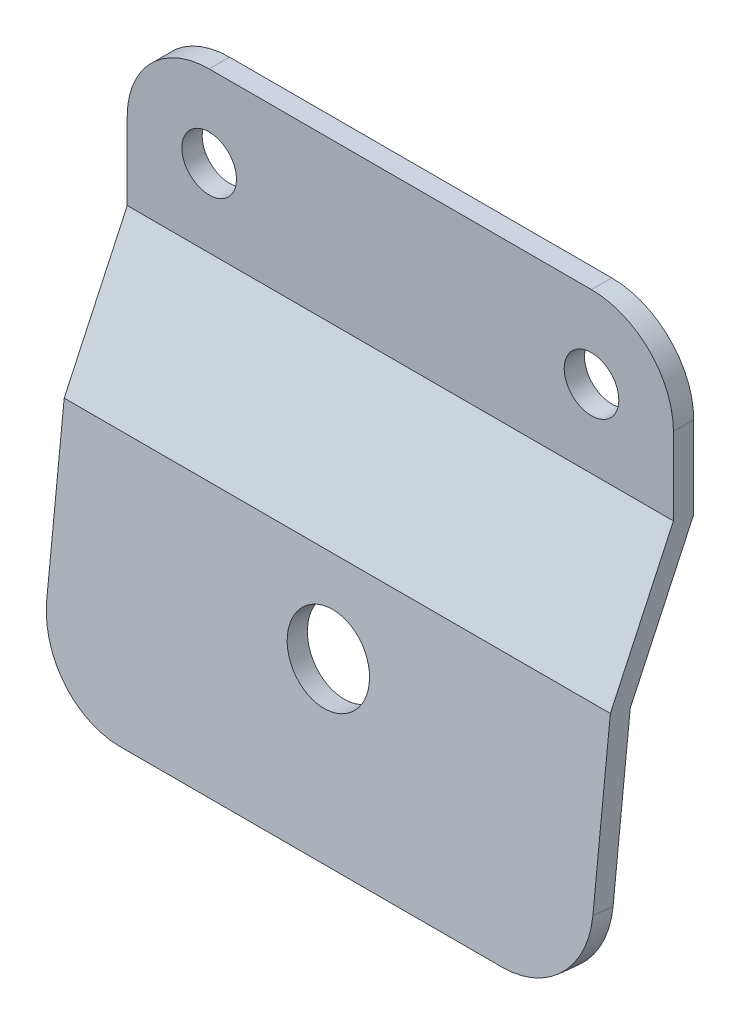
ISO-10303-21;
HEADER;
FILE_DESCRIPTION(('STEP AP214'),'2;1');
FILE_NAME('part.step','',(''),(''),'','','');
FILE_SCHEMA(('AUTOMOTIVE_DESIGN { 1 0 10303 214 1 1 1 1 }'));
ENDSEC;
DATA;
#1=APPLICATION_CONTEXT('core data for automotive mechanical design processes');
#2=APPLICATION_PROTOCOL_DEFINITION('international standard','automotive_design',2000,#1);
#3=PRODUCT_CONTEXT('',#1,'mechanical');
#4=PRODUCT('Part','Part','',(#3));
#5=PRODUCT_RELATED_PRODUCT_CATEGORY('part','',(#4));
#6=PRODUCT_DEFINITION_FORMATION('','',#4);
#7=PRODUCT_DEFINITION_CONTEXT('part definition',#1,'design');
#8=PRODUCT_DEFINITION('design','',#6,#7);
#9=PRODUCT_DEFINITION_SHAPE('','',#8);
#10=(LENGTH_UNIT() NAMED_UNIT(*) SI_UNIT(.MILLI.,.METRE.));
#11=(NAMED_UNIT(*) PLANE_ANGLE_UNIT() SI_UNIT($,.RADIAN.));
#12=(NAMED_UNIT(*) SI_UNIT($,.STERADIAN.) SOLID_ANGLE_UNIT());
#13=UNCERTAINTY_MEASURE_WITH_UNIT(LENGTH_MEASURE(1.E-05),#10,'distance_accuracy_value','');
#14=(GEOMETRIC_REPRESENTATION_CONTEXT(3) GLOBAL_UNCERTAINTY_ASSIGNED_CONTEXT((#13)) GLOBAL_UNIT_ASSIGNED_CONTEXT((#10,
#11,#12)) REPRESENTATION_CONTEXT('',''));
#15=CARTESIAN_POINT('',(0.,0.,0.));
#16=DIRECTION('',(0.,0.,1.));
#17=DIRECTION('',(1.,0.,0.));
#18=AXIS2_PLACEMENT_3D('',#15,#16,#17);
#19=CARTESIAN_POINT('',(31.75,-15.590992704092,9.73459826881002));
#20=DIRECTION('',(0.,-0.104528463267654,-0.994521895368273));
#21=DIRECTION('',(0.,0.994521895368273,-0.104528463267654));
#22=AXIS2_PLACEMENT_3D('',#19,#20,#21);
#23=PLANE('',#22);
#24=CARTESIAN_POINT('',(0.,-25.0638137574748,10.7302318814344));
#25=DIRECTION('',(0.,-0.104528463267654,-0.994521895368273));
#26=DIRECTION('',(0.,0.994521895368273,-0.104528463267654));
#27=AXIS2_PLACEMENT_3D('',#24,#25,#26);
#28=CIRCLE('',#27,4.7625);
#29=CARTESIAN_POINT('',(0.,-20.3274032307834,10.2324150751222));
#30=VERTEX_POINT('',#29);
#31=EDGE_CURVE('E190',#30,#30,#28,.T.);
#32=ORIENTED_EDGE('',*,*,#31,.T.);
#33=EDGE_LOOP('',(#32));
#34=FACE_BOUND('',#33,.T.);
#35=DIRECTION('',(0.,-0.994521895368273,0.104528463267654));
#36=VECTOR('',#35,1.);
#37=CARTESIAN_POINT('',(-31.75,-15.590992704092,9.73459826881002));
#38=LINE('',#37,#36);
#39=CARTESIAN_POINT('',(-31.75,-15.1978614696643,9.69327851105644));
#40=VERTEX_POINT('',#39);
#41=CARTESIAN_POINT('',(-31.75,-34.5366348108576,11.7258654940588));
#42=VERTEX_POINT('',#41);
#43=EDGE_CURVE('E144',#40,#42,#38,.T.);
#44=ORIENTED_EDGE('',*,*,#43,.T.);
#45=CARTESIAN_POINT('',(-22.225,-34.5366348108576,11.7258654940588));
#46=DIRECTION('',(0.,-0.104528463267654,-0.994521895368273));
#47=DIRECTION('',(0.,0.994521895368273,-0.104528463267654));
#48=AXIS2_PLACEMENT_3D('',#45,#46,#47);
#49=CIRCLE('',#48,9.525);
#50=CARTESIAN_POINT('',(-22.225,-44.0094558642404,12.7214991066832));
#51=VERTEX_POINT('',#50);
#52=EDGE_CURVE('E204',#42,#51,#49,.F.);
#53=ORIENTED_EDGE('',*,*,#52,.T.);
#54=DIRECTION('',(-1.,0.,0.));
#55=VECTOR('',#54,1.);
#56=CARTESIAN_POINT('',(31.75,-44.0094558642404,12.7214991066832));
#57=LINE('',#56,#55);
#58=CARTESIAN_POINT('',(22.225,-44.0094558642404,12.7214991066832));
#59=VERTEX_POINT('',#58);
#60=EDGE_CURVE('E183',#59,#51,#57,.T.);
#61=ORIENTED_EDGE('',*,*,#60,.F.);
#62=CARTESIAN_POINT('',(22.225,-34.5366348108576,11.7258654940588));
#63=DIRECTION('',(0.,-0.104528463267654,-0.994521895368273));
#64=DIRECTION('',(0.,0.994521895368273,-0.104528463267654));
#65=AXIS2_PLACEMENT_3D('',#62,#63,#64);
#66=CIRCLE('',#65,9.525);
#67=CARTESIAN_POINT('',(31.75,-34.5366348108576,11.7258654940588));
#68=VERTEX_POINT('',#67);
#69=EDGE_CURVE('E202',#59,#68,#66,.F.);
#70=ORIENTED_EDGE('',*,*,#69,.T.);
#71=DIRECTION('',(0.,-0.994521895368273,0.104528463267654));
#72=VECTOR('',#71,1.);
#73=CARTESIAN_POINT('',(31.75,-15.590992704092,9.73459826881002));
#74=LINE('',#73,#72);
#75=CARTESIAN_POINT('',(31.75,-15.1978614696643,9.69327851105644));
#76=VERTEX_POINT('',#75);
#77=EDGE_CURVE('E158',#76,#68,#74,.T.);
#78=ORIENTED_EDGE('',*,*,#77,.F.);
#79=DIRECTION('',(-1.,0.,0.));
#80=VECTOR('',#79,1.);
#81=CARTESIAN_POINT('',(31.75,-15.1978614696643,9.69327851105644));
#82=LINE('',#81,#80);
#83=EDGE_CURVE('E170',#76,#40,#82,.T.);
#84=ORIENTED_EDGE('',*,*,#83,.T.);
#85=EDGE_LOOP('',(#44,#53,#61,#70,#78,#84));
#86=FACE_BOUND('',#85,.T.);
#87=ADVANCED_FACE('F32',(#34,#86),#23,.F.);
#88=CARTESIAN_POINT('',(31.75,-44.2563730001713,10.3722394854443));
#89=DIRECTION('',(0.,-0.994521895368273,0.104528463267656));
#90=DIRECTION('',(0.,-0.104528463267656,-0.994521895368273));
#91=AXIS2_PLACEMENT_3D('',#88,#89,#90);
#92=PLANE('',#91);
#93=ORIENTED_EDGE('',*,*,#60,.T.);
#94=DIRECTION('',(0.,0.104528463267656,0.994521895368273));
#95=VECTOR('',#94,1.);
#96=CARTESIAN_POINT('',(-22.225,-44.2563730001713,10.3722394854443));
#97=LINE('',#96,#95);
#98=CARTESIAN_POINT('',(-22.225,-44.2563730001713,10.3722394854443));
#99=VERTEX_POINT('',#98);
#100=EDGE_CURVE('E209',#51,#99,#97,.F.);
#101=ORIENTED_EDGE('',*,*,#100,.T.);
#102=DIRECTION('',(-1.,0.,0.));
#103=VECTOR('',#102,1.);
#104=CARTESIAN_POINT('',(31.75,-44.2563730001713,10.3722394854443));
#105=LINE('',#104,#103);
#106=CARTESIAN_POINT('',(22.225,-44.2563730001713,10.3722394854443));
#107=VERTEX_POINT('',#106);
#108=EDGE_CURVE('E132',#107,#99,#105,.T.);
#109=ORIENTED_EDGE('',*,*,#108,.F.);
#110=DIRECTION('',(0.,0.104528463267656,0.994521895368273));
#111=VECTOR('',#110,1.);
#112=CARTESIAN_POINT('',(22.225,-44.0094558642404,12.7214991066832));
#113=LINE('',#112,#111);
#114=EDGE_CURVE('E206',#107,#59,#113,.T.);
#115=ORIENTED_EDGE('',*,*,#114,.T.);
#116=EDGE_LOOP('',(#93,#101,#109,#115));
#117=FACE_BOUND('',#116,.T.);
#118=ADVANCED_FACE('F259',(#117),#92,.T.);
#119=CARTESIAN_POINT('',(31.75,-15.8379098400229,7.38533864757108));
#120=DIRECTION('',(0.,-0.104528463267654,-0.994521895368273));
#121=DIRECTION('',(0.,0.994521895368273,-0.104528463267654));
#122=AXIS2_PLACEMENT_3D('',#119,#120,#121);
#123=PLANE('',#122);
#124=CARTESIAN_POINT('',(0.,-25.3107308934057,8.38097226019548));
#125=DIRECTION('',(0.,-0.104528463267654,-0.994521895368273));
#126=DIRECTION('',(0.,0.994521895368273,-0.104528463267654));
#127=AXIS2_PLACEMENT_3D('',#124,#125,#126);
#128=CIRCLE('',#127,4.7625);
#129=CARTESIAN_POINT('',(0.,-20.5743203667143,7.88315545388328));
#130=VERTEX_POINT('',#129);
#131=EDGE_CURVE('E187',#130,#130,#128,.T.);
#132=ORIENTED_EDGE('',*,*,#131,.F.);
#133=EDGE_LOOP('',(#132));
#134=FACE_BOUND('',#133,.T.);
#135=ORIENTED_EDGE('',*,*,#108,.T.);
#136=CARTESIAN_POINT('',(-22.225,-34.7835519467885,9.37660587281988));
#137=DIRECTION('',(0.,-0.104528463267654,-0.994521895368273));
#138=DIRECTION('',(0.,0.994521895368273,-0.104528463267654));
#139=AXIS2_PLACEMENT_3D('',#136,#137,#138);
#140=CIRCLE('',#139,9.525);
#141=CARTESIAN_POINT('',(-31.75,-34.7835519467885,9.37660587281988));
#142=VERTEX_POINT('',#141);
#143=EDGE_CURVE('E140',#99,#142,#140,.T.);
#144=ORIENTED_EDGE('',*,*,#143,.T.);
#145=DIRECTION('',(0.,-0.994521895368273,0.104528463267654));
#146=VECTOR('',#145,1.);
#147=CARTESIAN_POINT('',(-31.75,-15.8379098400229,7.38533864757108));
#148=LINE('',#147,#146);
#149=CARTESIAN_POINT('',(-31.75,-15.8379098400229,7.38533864757108));
#150=VERTEX_POINT('',#149);
#151=EDGE_CURVE('E136',#150,#142,#148,.T.);
#152=ORIENTED_EDGE('',*,*,#151,.F.);
#153=DIRECTION('',(-1.,0.,0.));
#154=VECTOR('',#153,1.);
#155=CARTESIAN_POINT('',(31.75,-15.8379098400229,7.38533864757108));
#156=LINE('',#155,#154);
#157=CARTESIAN_POINT('',(31.75,-15.8379098400229,7.38533864757108));
#158=VERTEX_POINT('',#157);
#159=EDGE_CURVE('E121',#158,#150,#156,.T.);
#160=ORIENTED_EDGE('',*,*,#159,.F.);
#161=DIRECTION('',(0.,-0.994521895368273,0.104528463267654));
#162=VECTOR('',#161,1.);
#163=CARTESIAN_POINT('',(31.75,-15.8379098400229,7.38533864757108));
#164=LINE('',#163,#162);
#165=CARTESIAN_POINT('',(31.75,-34.7835519467885,9.37660587281988));
#166=VERTEX_POINT('',#165);
#167=EDGE_CURVE('E161',#158,#166,#164,.T.);
#168=ORIENTED_EDGE('',*,*,#167,.T.);
#169=CARTESIAN_POINT('',(22.225,-34.7835519467885,9.37660587281988));
#170=DIRECTION('',(0.,-0.104528463267654,-0.994521895368273));
#171=DIRECTION('',(0.,0.994521895368273,-0.104528463267654));
#172=AXIS2_PLACEMENT_3D('',#169,#170,#171);
#173=CIRCLE('',#172,9.525);
#174=EDGE_CURVE('E211',#166,#107,#173,.T.);
#175=ORIENTED_EDGE('',*,*,#174,.T.);
#176=EDGE_LOOP('',(#135,#144,#152,#160,#168,#175));
#177=FACE_BOUND('',#176,.T.);
#178=ADVANCED_FACE('F138',(#134,#177),#123,.T.);
#179=CARTESIAN_POINT('',(31.75,0.,0.));
#180=DIRECTION('',(0.,-0.4226182617407,-0.90630778703665));
#181=DIRECTION('',(0.,0.90630778703665,-0.4226182617407));
#182=AXIS2_PLACEMENT_3D('',#179,#180,#181);
#183=PLANE('',#182);
#184=DIRECTION('',(0.,-0.90630778703665,0.4226182617407));
#185=VECTOR('',#184,1.);
#186=CARTESIAN_POINT('',(-31.75,0.,0.));
#187=LINE('',#186,#185);
#188=CARTESIAN_POINT('',(-31.75,0.,0.));
#189=VERTEX_POINT('',#188);
#190=EDGE_CURVE('E126',#189,#150,#187,.T.);
#191=ORIENTED_EDGE('',*,*,#190,.F.);
#192=DIRECTION('',(-1.,0.,0.));
#193=VECTOR('',#192,1.);
#194=CARTESIAN_POINT('',(31.75,0.,0.));
#195=LINE('',#194,#193);
#196=CARTESIAN_POINT('',(31.75,0.,0.));
#197=VERTEX_POINT('',#196);
#198=EDGE_CURVE('E133',#197,#189,#195,.T.);
#199=ORIENTED_EDGE('',*,*,#198,.F.);
#200=DIRECTION('',(0.,-0.90630778703665,0.4226182617407));
#201=VECTOR('',#200,1.);
#202=CARTESIAN_POINT('',(31.75,0.,0.));
#203=LINE('',#202,#201);
#204=EDGE_CURVE('E128',#197,#158,#203,.T.);
#205=ORIENTED_EDGE('',*,*,#204,.T.);
#206=ORIENTED_EDGE('',*,*,#159,.T.);
#207=EDGE_LOOP('',(#191,#199,#205,#206));
#208=FACE_BOUND('',#207,.T.);
#209=ADVANCED_FACE('F123',(#208),#183,.T.);
#210=CARTESIAN_POINT('',(31.75,19.05,0.));
#211=DIRECTION('',(0.,0.,-1.));
#212=DIRECTION('',(0.,1.,0.));
#213=AXIS2_PLACEMENT_3D('',#210,#211,#212);
#214=PLANE('',#213);
#215=CARTESIAN_POINT('',(-22.225,9.525,0.));
#216=DIRECTION('',(0.,0.,-1.));
#217=DIRECTION('',(0.,-1.,0.));
#218=AXIS2_PLACEMENT_3D('',#215,#216,#217);
#219=CIRCLE('',#218,3.175);
#220=CARTESIAN_POINT('',(-22.225,6.35,0.));
#221=VERTEX_POINT('',#220);
#222=EDGE_CURVE('E198',#221,#221,#219,.T.);
#223=ORIENTED_EDGE('',*,*,#222,.F.);
#224=EDGE_LOOP('',(#223));
#225=FACE_BOUND('',#224,.T.);
#226=CARTESIAN_POINT('',(22.225,9.525,0.));
#227=DIRECTION('',(0.,0.,-1.));
#228=DIRECTION('',(0.,1.,0.));
#229=AXIS2_PLACEMENT_3D('',#226,#227,#228);
#230=CIRCLE('',#229,3.175);
#231=CARTESIAN_POINT('',(22.225,12.7,0.));
#232=VERTEX_POINT('',#231);
#233=EDGE_CURVE('E194',#232,#232,#230,.T.);
#234=ORIENTED_EDGE('',*,*,#233,.F.);
#235=EDGE_LOOP('',(#234));
#236=FACE_BOUND('',#235,.T.);
#237=DIRECTION('',(-1.,0.,0.));
#238=VECTOR('',#237,1.);
#239=CARTESIAN_POINT('',(31.75,19.05,0.));
#240=LINE('',#239,#238);
#241=CARTESIAN_POINT('',(22.225,19.05,0.));
#242=VERTEX_POINT('',#241);
#243=CARTESIAN_POINT('',(-22.225,19.05,0.));
#244=VERTEX_POINT('',#243);
#245=EDGE_CURVE('E179',#242,#244,#240,.T.);
#246=ORIENTED_EDGE('',*,*,#245,.F.);
#247=CARTESIAN_POINT('',(22.225,9.525,0.));
#248=DIRECTION('',(0.,0.,-1.));
#249=DIRECTION('',(0.,1.,0.));
#250=AXIS2_PLACEMENT_3D('',#247,#248,#249);
#251=CIRCLE('',#250,9.525);
#252=CARTESIAN_POINT('',(31.75,9.525,0.));
#253=VERTEX_POINT('',#252);
#254=EDGE_CURVE('E54',#242,#253,#251,.T.);
#255=ORIENTED_EDGE('',*,*,#254,.T.);
#256=DIRECTION('',(0.,-1.,0.));
#257=VECTOR('',#256,1.);
#258=CARTESIAN_POINT('',(31.75,19.05,0.));
#259=LINE('',#258,#257);
#260=EDGE_CURVE('E164',#253,#197,#259,.T.);
#261=ORIENTED_EDGE('',*,*,#260,.T.);
#262=ORIENTED_EDGE('',*,*,#198,.T.);
#263=DIRECTION('',(0.,-1.,0.));
#264=VECTOR('',#263,1.);
#265=CARTESIAN_POINT('',(-31.75,19.05,0.));
#266=LINE('',#265,#264);
#267=CARTESIAN_POINT('',(-31.75,9.525,0.));
#268=VERTEX_POINT('',#267);
#269=EDGE_CURVE('E148',#268,#189,#266,.T.);
#270=ORIENTED_EDGE('',*,*,#269,.F.);
#271=CARTESIAN_POINT('',(-22.225,9.525,0.));
#272=DIRECTION('',(0.,0.,-1.));
#273=DIRECTION('',(0.,1.,0.));
#274=AXIS2_PLACEMENT_3D('',#271,#272,#273);
#275=CIRCLE('',#274,9.525);
#276=EDGE_CURVE('E46',#268,#244,#275,.T.);
#277=ORIENTED_EDGE('',*,*,#276,.T.);
#278=EDGE_LOOP('',(#246,#255,#261,#262,#270,#277));
#279=FACE_BOUND('',#278,.T.);
#280=ADVANCED_FACE('F238',(#225,#236,#279),#214,.T.);
#281=CARTESIAN_POINT('',(31.75,19.05,2.3622));
#282=DIRECTION('',(0.,1.,0.));
#283=DIRECTION('',(0.,0.,1.));
#284=AXIS2_PLACEMENT_3D('',#281,#282,#283);
#285=PLANE('',#284);
#286=DIRECTION('',(-1.,0.,0.));
#287=VECTOR('',#286,1.);
#288=CARTESIAN_POINT('',(31.75,19.05,2.3622));
#289=LINE('',#288,#287);
#290=CARTESIAN_POINT('',(22.225,19.05,2.3622));
#291=VERTEX_POINT('',#290);
#292=CARTESIAN_POINT('',(-22.225,19.05,2.3622));
#293=VERTEX_POINT('',#292);
#294=EDGE_CURVE('E176',#291,#293,#289,.T.);
#295=ORIENTED_EDGE('',*,*,#294,.F.);
#296=DIRECTION('',(0.,0.,-1.));
#297=VECTOR('',#296,1.);
#298=CARTESIAN_POINT('',(22.225,19.05,0.));
#299=LINE('',#298,#297);
#300=EDGE_CURVE('E220',#291,#242,#299,.T.);
#301=ORIENTED_EDGE('',*,*,#300,.T.);
#302=ORIENTED_EDGE('',*,*,#245,.T.);
#303=DIRECTION('',(0.,0.,-1.));
#304=VECTOR('',#303,1.);
#305=CARTESIAN_POINT('',(-22.225,19.05,2.3622));
#306=LINE('',#305,#304);
#307=EDGE_CURVE('E218',#244,#293,#306,.F.);
#308=ORIENTED_EDGE('',*,*,#307,.T.);
#309=EDGE_LOOP('',(#295,#301,#302,#308));
#310=FACE_BOUND('',#309,.T.);
#311=ADVANCED_FACE('F237',(#310),#285,.T.);
#312=CARTESIAN_POINT('',(31.75,19.05,2.3622));
#313=DIRECTION('',(0.,0.,-1.));
#314=DIRECTION('',(0.,1.,0.));
#315=AXIS2_PLACEMENT_3D('',#312,#313,#314);
#316=PLANE('',#315);
#317=CARTESIAN_POINT('',(-22.225,9.525,2.3622));
#318=DIRECTION('',(0.,0.,-1.));
#319=DIRECTION('',(0.,1.,0.));
#320=AXIS2_PLACEMENT_3D('',#317,#318,#319);
#321=CIRCLE('',#320,3.175);
#322=CARTESIAN_POINT('',(-22.225,12.7,2.3622));
#323=VERTEX_POINT('',#322);
#324=EDGE_CURVE('E195',#323,#323,#321,.T.);
#325=ORIENTED_EDGE('',*,*,#324,.T.);
#326=EDGE_LOOP('',(#325));
#327=FACE_BOUND('',#326,.T.);
#328=CARTESIAN_POINT('',(22.225,9.525,2.3622));
#329=DIRECTION('',(0.,0.,-1.));
#330=DIRECTION('',(0.,1.,0.));
#331=AXIS2_PLACEMENT_3D('',#328,#329,#330);
#332=CIRCLE('',#331,3.175);
#333=CARTESIAN_POINT('',(22.225,12.7,2.3622));
#334=VERTEX_POINT('',#333);
#335=EDGE_CURVE('E191',#334,#334,#332,.T.);
#336=ORIENTED_EDGE('',*,*,#335,.T.);
#337=EDGE_LOOP('',(#336));
#338=FACE_BOUND('',#337,.T.);
#339=DIRECTION('',(0.,-1.,0.));
#340=VECTOR('',#339,1.);
#341=CARTESIAN_POINT('',(31.75,19.05,2.3622));
#342=LINE('',#341,#340);
#343=CARTESIAN_POINT('',(31.75,9.525,2.3622));
#344=VERTEX_POINT('',#343);
#345=CARTESIAN_POINT('',(31.75,0.523687132095153,2.3622));
#346=VERTEX_POINT('',#345);
#347=EDGE_CURVE('E166',#344,#346,#342,.T.);
#348=ORIENTED_EDGE('',*,*,#347,.F.);
#349=CARTESIAN_POINT('',(22.225,9.525,2.3622));
#350=DIRECTION('',(0.,0.,-1.));
#351=DIRECTION('',(0.,1.,0.));
#352=AXIS2_PLACEMENT_3D('',#349,#350,#351);
#353=CIRCLE('',#352,9.525);
#354=EDGE_CURVE('E11',#344,#291,#353,.F.);
#355=ORIENTED_EDGE('',*,*,#354,.T.);
#356=ORIENTED_EDGE('',*,*,#294,.T.);
#357=CARTESIAN_POINT('',(-22.225,9.525,2.3622));
#358=DIRECTION('',(0.,0.,-1.));
#359=DIRECTION('',(0.,1.,0.));
#360=AXIS2_PLACEMENT_3D('',#357,#358,#359);
#361=CIRCLE('',#360,9.525);
#362=CARTESIAN_POINT('',(-31.75,9.525,2.3622));
#363=VERTEX_POINT('',#362);
#364=EDGE_CURVE('E39',#293,#363,#361,.F.);
#365=ORIENTED_EDGE('',*,*,#364,.T.);
#366=DIRECTION('',(0.,-1.,0.));
#367=VECTOR('',#366,1.);
#368=CARTESIAN_POINT('',(-31.75,19.05,2.3622));
#369=LINE('',#368,#367);
#370=CARTESIAN_POINT('',(-31.75,0.523687132095153,2.3622));
#371=VERTEX_POINT('',#370);
#372=EDGE_CURVE('E151',#363,#371,#369,.T.);
#373=ORIENTED_EDGE('',*,*,#372,.T.);
#374=DIRECTION('',(-1.,0.,0.));
#375=VECTOR('',#374,1.);
#376=CARTESIAN_POINT('',(31.75,0.523687132095153,2.3622));
#377=LINE('',#376,#375);
#378=EDGE_CURVE('E173',#346,#371,#377,.T.);
#379=ORIENTED_EDGE('',*,*,#378,.F.);
#380=EDGE_LOOP('',(#348,#355,#356,#365,#373,#379));
#381=FACE_BOUND('',#380,.T.);
#382=ADVANCED_FACE('F227',(#327,#338,#381),#316,.F.);
#383=CARTESIAN_POINT('',(31.75,0.998308857883882,2.14088025453797));
#384=DIRECTION('',(0.,-0.4226182617407,-0.90630778703665));
#385=DIRECTION('',(0.,0.90630778703665,-0.4226182617407));
#386=AXIS2_PLACEMENT_3D('',#383,#384,#385);
#387=PLANE('',#386);
#388=DIRECTION('',(0.,-0.90630778703665,0.4226182617407));
#389=VECTOR('',#388,1.);
#390=CARTESIAN_POINT('',(-31.75,0.998308857883882,2.14088025453797));
#391=LINE('',#390,#389);
#392=EDGE_CURVE('E156',#371,#40,#391,.T.);
#393=ORIENTED_EDGE('',*,*,#392,.T.);
#394=ORIENTED_EDGE('',*,*,#83,.F.);
#395=DIRECTION('',(0.,-0.90630778703665,0.4226182617407));
#396=VECTOR('',#395,1.);
#397=CARTESIAN_POINT('',(31.75,0.998308857883882,2.14088025453797));
#398=LINE('',#397,#396);
#399=EDGE_CURVE('E168',#346,#76,#398,.T.);
#400=ORIENTED_EDGE('',*,*,#399,.F.);
#401=ORIENTED_EDGE('',*,*,#378,.T.);
#402=EDGE_LOOP('',(#393,#394,#400,#401));
#403=FACE_BOUND('',#402,.T.);
#404=ADVANCED_FACE('F249',(#403),#387,.F.);
#405=CARTESIAN_POINT('',(31.75,-44.0094558642404,12.7214991066832));
#406=DIRECTION('',(-1.,0.,0.));
#407=DIRECTION('',(0.,0.,1.));
#408=AXIS2_PLACEMENT_3D('',#405,#406,#407);
#409=PLANE('',#408);
#410=ORIENTED_EDGE('',*,*,#77,.T.);
#411=DIRECTION('',(0.,0.104528463267656,0.994521895368273));
#412=VECTOR('',#411,1.);
#413=CARTESIAN_POINT('',(31.75,-34.7835519467885,9.37660587281986));
#414=LINE('',#413,#412);
#415=EDGE_CURVE('E216',#68,#166,#414,.F.);
#416=ORIENTED_EDGE('',*,*,#415,.T.);
#417=ORIENTED_EDGE('',*,*,#167,.F.);
#418=ORIENTED_EDGE('',*,*,#204,.F.);
#419=ORIENTED_EDGE('',*,*,#260,.F.);
#420=DIRECTION('',(0.,0.,-1.));
#421=VECTOR('',#420,1.);
#422=CARTESIAN_POINT('',(31.75,9.525,2.3622));
#423=LINE('',#422,#421);
#424=EDGE_CURVE('E214',#253,#344,#423,.F.);
#425=ORIENTED_EDGE('',*,*,#424,.T.);
#426=ORIENTED_EDGE('',*,*,#347,.T.);
#427=ORIENTED_EDGE('',*,*,#399,.T.);
#428=EDGE_LOOP('',(#410,#416,#417,#418,#419,#425,#426,#427));
#429=FACE_BOUND('',#428,.T.);
#430=ADVANCED_FACE('F241',(#429),#409,.F.);
#431=CARTESIAN_POINT('',(-31.75,-44.0094558642404,12.7214991066832));
#432=DIRECTION('',(-1.,0.,0.));
#433=DIRECTION('',(0.,0.,1.));
#434=AXIS2_PLACEMENT_3D('',#431,#432,#433);
#435=PLANE('',#434);
#436=ORIENTED_EDGE('',*,*,#151,.T.);
#437=DIRECTION('',(0.,0.104528463267656,0.994521895368273));
#438=VECTOR('',#437,1.);
#439=CARTESIAN_POINT('',(-31.75,-34.5366348108576,11.7258654940588));
#440=LINE('',#439,#438);
#441=EDGE_CURVE('E200',#142,#42,#440,.T.);
#442=ORIENTED_EDGE('',*,*,#441,.T.);
#443=ORIENTED_EDGE('',*,*,#43,.F.);
#444=ORIENTED_EDGE('',*,*,#392,.F.);
#445=ORIENTED_EDGE('',*,*,#372,.F.);
#446=DIRECTION('',(0.,0.,-1.));
#447=VECTOR('',#446,1.);
#448=CARTESIAN_POINT('',(-31.75,9.525,12.7214991066832));
#449=LINE('',#448,#447);
#450=EDGE_CURVE('E186',#363,#268,#449,.T.);
#451=ORIENTED_EDGE('',*,*,#450,.T.);
#452=ORIENTED_EDGE('',*,*,#269,.T.);
#453=ORIENTED_EDGE('',*,*,#190,.T.);
#454=EDGE_LOOP('',(#436,#442,#443,#444,#445,#451,#452,#453));
#455=FACE_BOUND('',#454,.T.);
#456=ADVANCED_FACE('F146',(#455),#435,.T.);
#457=CARTESIAN_POINT('',(0.,-26.3889858178984,-1.87793806598855));
#458=DIRECTION('',(0.,0.104528463267654,0.994521895368273));
#459=DIRECTION('',(0.,-0.994521895368273,0.104528463267654));
#460=AXIS2_PLACEMENT_3D('',#457,#458,#459);
#461=CYLINDRICAL_SURFACE('',#460,4.7625);
#462=ORIENTED_EDGE('',*,*,#131,.T.);
#463=EDGE_LOOP('',(#462));
#464=FACE_BOUND('',#463,.T.);
#465=ORIENTED_EDGE('',*,*,#31,.F.);
#466=EDGE_LOOP('',(#465));
#467=FACE_BOUND('',#466,.T.);
#468=ADVANCED_FACE('F282',(#464,#467),#461,.F.);
#469=CARTESIAN_POINT('',(22.225,9.525,12.7214991066832));
#470=DIRECTION('',(0.,0.,-1.));
#471=DIRECTION('',(0.,1.,0.));
#472=AXIS2_PLACEMENT_3D('',#469,#470,#471);
#473=CYLINDRICAL_SURFACE('',#472,3.175);
#474=ORIENTED_EDGE('',*,*,#233,.T.);
#475=EDGE_LOOP('',(#474));
#476=FACE_BOUND('',#475,.T.);
#477=ORIENTED_EDGE('',*,*,#335,.F.);
#478=EDGE_LOOP('',(#477));
#479=FACE_BOUND('',#478,.T.);
#480=ADVANCED_FACE('F279',(#476,#479),#473,.F.);
#481=CARTESIAN_POINT('',(-22.225,9.525,12.7214991066832));
#482=DIRECTION('',(0.,0.,-1.));
#483=DIRECTION('',(0.,1.,0.));
#484=AXIS2_PLACEMENT_3D('',#481,#482,#483);
#485=CYLINDRICAL_SURFACE('',#484,3.175);
#486=ORIENTED_EDGE('',*,*,#222,.T.);
#487=EDGE_LOOP('',(#486));
#488=FACE_BOUND('',#487,.T.);
#489=ORIENTED_EDGE('',*,*,#324,.F.);
#490=EDGE_LOOP('',(#489));
#491=FACE_BOUND('',#490,.T.);
#492=ADVANCED_FACE('F271',(#488,#491),#485,.F.);
#493=CARTESIAN_POINT('',(-22.225,-34.5366348108576,11.7258654940588));
#494=DIRECTION('',(0.,0.104528463267656,0.994521895368273));
#495=DIRECTION('',(0.,-0.994521895368273,0.104528463267656));
#496=AXIS2_PLACEMENT_3D('',#493,#494,#495);
#497=CYLINDRICAL_SURFACE('',#496,9.525);
#498=ORIENTED_EDGE('',*,*,#143,.F.);
#499=ORIENTED_EDGE('',*,*,#100,.F.);
#500=ORIENTED_EDGE('',*,*,#52,.F.);
#501=ORIENTED_EDGE('',*,*,#441,.F.);
#502=EDGE_LOOP('',(#498,#499,#500,#501));
#503=FACE_BOUND('',#502,.T.);
#504=ADVANCED_FACE('F262',(#503),#497,.T.);
#505=CARTESIAN_POINT('',(22.225,-34.7835519467885,9.37660587281986));
#506=DIRECTION('',(0.,-0.104528463267656,-0.994521895368273));
#507=DIRECTION('',(0.,0.994521895368273,-0.104528463267656));
#508=AXIS2_PLACEMENT_3D('',#505,#506,#507);
#509=CYLINDRICAL_SURFACE('',#508,9.525);
#510=ORIENTED_EDGE('',*,*,#174,.F.);
#511=ORIENTED_EDGE('',*,*,#415,.F.);
#512=ORIENTED_EDGE('',*,*,#69,.F.);
#513=ORIENTED_EDGE('',*,*,#114,.F.);
#514=EDGE_LOOP('',(#510,#511,#512,#513));
#515=FACE_BOUND('',#514,.T.);
#516=ADVANCED_FACE('F256',(#515),#509,.T.);
#517=CARTESIAN_POINT('',(22.225,9.525,2.3622));
#518=DIRECTION('',(0.,0.,1.));
#519=DIRECTION('',(1.,0.,0.));
#520=AXIS2_PLACEMENT_3D('',#517,#518,#519);
#521=CYLINDRICAL_SURFACE('',#520,9.525);
#522=ORIENTED_EDGE('',*,*,#354,.F.);
#523=ORIENTED_EDGE('',*,*,#424,.F.);
#524=ORIENTED_EDGE('',*,*,#254,.F.);
#525=ORIENTED_EDGE('',*,*,#300,.F.);
#526=EDGE_LOOP('',(#522,#523,#524,#525));
#527=FACE_BOUND('',#526,.T.);
#528=ADVANCED_FACE('F243',(#527),#521,.T.);
#529=CARTESIAN_POINT('',(-22.225,9.525,12.7214991066832));
#530=DIRECTION('',(0.,0.,-1.));
#531=DIRECTION('',(-1.,0.,0.));
#532=AXIS2_PLACEMENT_3D('',#529,#530,#531);
#533=CYLINDRICAL_SURFACE('',#532,9.525);
#534=ORIENTED_EDGE('',*,*,#364,.F.);
#535=ORIENTED_EDGE('',*,*,#307,.F.);
#536=ORIENTED_EDGE('',*,*,#276,.F.);
#537=ORIENTED_EDGE('',*,*,#450,.F.);
#538=EDGE_LOOP('',(#534,#535,#536,#537));
#539=FACE_BOUND('',#538,.T.);
#540=ADVANCED_FACE('F235',(#539),#533,.T.);
#541=CLOSED_SHELL('',(#87,#118,#178,#209,#280,#311,#382,#404,#430,#456,#468,#480,#492,#504,#516,
#528,#540));
#542=MANIFOLD_SOLID_BREP('B2',#541);
#543=ADVANCED_BREP_SHAPE_REPRESENTATION('',(#18,#542),#14);
#544=SHAPE_DEFINITION_REPRESENTATION(#9,#543);
ENDSEC;
END-ISO-10303-21;
